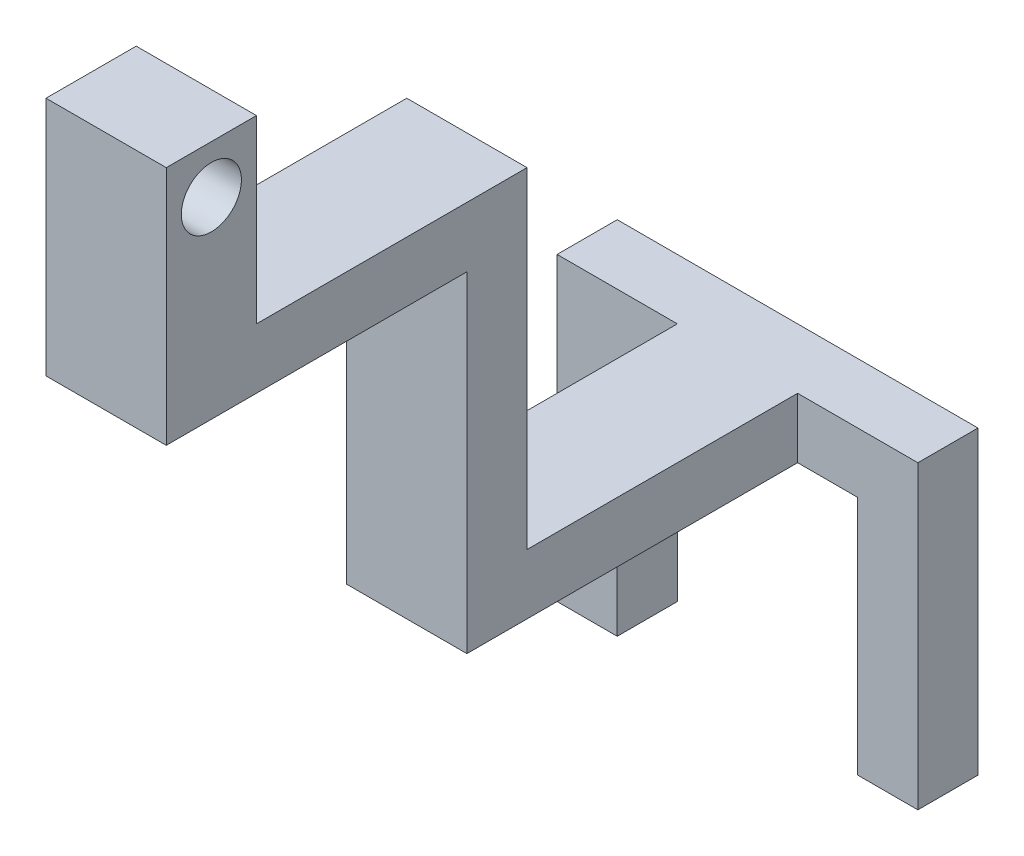
ISO-10303-21;
HEADER;
FILE_DESCRIPTION(('STEP AP214'),'2;1');
FILE_NAME('part.step','',(''),(''),'','','');
FILE_SCHEMA(('AUTOMOTIVE_DESIGN { 1 0 10303 214 1 1 1 1 }'));
ENDSEC;
DATA;
#1=APPLICATION_CONTEXT('core data for automotive mechanical design processes');
#2=APPLICATION_PROTOCOL_DEFINITION('international standard','automotive_design',2000,#1);
#3=PRODUCT_CONTEXT('',#1,'mechanical');
#4=PRODUCT('Part','Part','',(#3));
#5=PRODUCT_RELATED_PRODUCT_CATEGORY('part','',(#4));
#6=PRODUCT_DEFINITION_FORMATION('','',#4);
#7=PRODUCT_DEFINITION_CONTEXT('part definition',#1,'design');
#8=PRODUCT_DEFINITION('design','',#6,#7);
#9=PRODUCT_DEFINITION_SHAPE('','',#8);
#10=(LENGTH_UNIT() NAMED_UNIT(*) SI_UNIT(.MILLI.,.METRE.));
#11=(NAMED_UNIT(*) PLANE_ANGLE_UNIT() SI_UNIT($,.RADIAN.));
#12=(NAMED_UNIT(*) SI_UNIT($,.STERADIAN.) SOLID_ANGLE_UNIT());
#13=UNCERTAINTY_MEASURE_WITH_UNIT(LENGTH_MEASURE(1.E-05),#10,'distance_accuracy_value','');
#14=(GEOMETRIC_REPRESENTATION_CONTEXT(3) GLOBAL_UNCERTAINTY_ASSIGNED_CONTEXT((#13)) GLOBAL_UNIT_ASSIGNED_CONTEXT((#10,
#11,#12)) REPRESENTATION_CONTEXT('',''));
#15=CARTESIAN_POINT('',(0.,0.,0.));
#16=DIRECTION('',(0.,0.,1.));
#17=DIRECTION('',(1.,0.,0.));
#18=AXIS2_PLACEMENT_3D('',#15,#16,#17);
#19=CARTESIAN_POINT('',(0.,55.,0.));
#20=DIRECTION('',(0.,-1.,0.));
#21=DIRECTION('',(0.,0.,-1.));
#22=AXIS2_PLACEMENT_3D('',#19,#20,#21);
#23=PLANE('',#22);
#24=DIRECTION('',(-1.,0.,0.));
#25=VECTOR('',#24,1.);
#26=CARTESIAN_POINT('',(20.,55.,100.));
#27=LINE('',#26,#25);
#28=CARTESIAN_POINT('',(40.,55.,100.));
#29=VERTEX_POINT('',#28);
#30=CARTESIAN_POINT('',(20.,55.,100.));
#31=VERTEX_POINT('',#30);
#32=EDGE_CURVE('E56',#29,#31,#27,.T.);
#33=ORIENTED_EDGE('',*,*,#32,.F.);
#34=DIRECTION('',(0.,0.,-1.));
#35=VECTOR('',#34,1.);
#36=CARTESIAN_POINT('',(40.,55.,65.));
#37=LINE('',#36,#35);
#38=CARTESIAN_POINT('',(40.,55.,55.));
#39=VERTEX_POINT('',#38);
#40=EDGE_CURVE('E216',#29,#39,#37,.T.);
#41=ORIENTED_EDGE('',*,*,#40,.T.);
#42=DIRECTION('',(-1.,0.,0.));
#43=VECTOR('',#42,1.);
#44=CARTESIAN_POINT('',(20.,55.,55.));
#45=LINE('',#44,#43);
#46=CARTESIAN_POINT('',(20.,55.,55.));
#47=VERTEX_POINT('',#46);
#48=EDGE_CURVE('E218',#39,#47,#45,.T.);
#49=ORIENTED_EDGE('',*,*,#48,.T.);
#50=DIRECTION('',(0.,0.,1.));
#51=VECTOR('',#50,1.);
#52=CARTESIAN_POINT('',(20.,55.,65.));
#53=LINE('',#52,#51);
#54=EDGE_CURVE('E214',#47,#31,#53,.T.);
#55=ORIENTED_EDGE('',*,*,#54,.T.);
#56=EDGE_LOOP('',(#33,#41,#49,#55));
#57=FACE_BOUND('',#56,.T.);
#58=ADVANCED_FACE('F41',(#57),#23,.F.);
#59=CARTESIAN_POINT('',(0.,0.,10.));
#60=DIRECTION('',(0.,-1.,0.));
#61=DIRECTION('',(0.,0.,-1.));
#62=AXIS2_PLACEMENT_3D('',#59,#60,#61);
#63=PLANE('',#62);
#64=DIRECTION('',(-1.,0.,0.));
#65=VECTOR('',#64,1.);
#66=CARTESIAN_POINT('',(20.,0.,55.));
#67=LINE('',#66,#65);
#68=CARTESIAN_POINT('',(40.,0.,55.));
#69=VERTEX_POINT('',#68);
#70=CARTESIAN_POINT('',(20.,0.,55.));
#71=VERTEX_POINT('',#70);
#72=EDGE_CURVE('E213',#69,#71,#67,.T.);
#73=ORIENTED_EDGE('',*,*,#72,.F.);
#74=DIRECTION('',(0.,0.,-1.));
#75=VECTOR('',#74,1.);
#76=CARTESIAN_POINT('',(40.,0.,65.));
#77=LINE('',#76,#75);
#78=CARTESIAN_POINT('',(40.,0.,10.));
#79=VERTEX_POINT('',#78);
#80=EDGE_CURVE('E241',#69,#79,#77,.T.);
#81=ORIENTED_EDGE('',*,*,#80,.T.);
#82=DIRECTION('',(-1.,0.,0.));
#83=VECTOR('',#82,1.);
#84=CARTESIAN_POINT('',(0.,0.,10.));
#85=LINE('',#84,#83);
#86=CARTESIAN_POINT('',(60.,0.,10.));
#87=VERTEX_POINT('',#86);
#88=EDGE_CURVE('E268',#87,#79,#85,.T.);
#89=ORIENTED_EDGE('',*,*,#88,.F.);
#90=DIRECTION('',(0.,0.,-1.));
#91=VECTOR('',#90,1.);
#92=CARTESIAN_POINT('',(60.,0.,10.));
#93=LINE('',#92,#91);
#94=CARTESIAN_POINT('',(60.,0.,0.));
#95=VERTEX_POINT('',#94);
#96=EDGE_CURVE('E289',#87,#95,#93,.T.);
#97=ORIENTED_EDGE('',*,*,#96,.T.);
#98=DIRECTION('',(-1.,0.,0.));
#99=VECTOR('',#98,1.);
#100=CARTESIAN_POINT('',(0.,0.,0.));
#101=LINE('',#100,#99);
#102=CARTESIAN_POINT('',(0.,0.,0.));
#103=VERTEX_POINT('',#102);
#104=EDGE_CURVE('E254',#95,#103,#101,.T.);
#105=ORIENTED_EDGE('',*,*,#104,.T.);
#106=DIRECTION('',(0.,0.,-1.));
#107=VECTOR('',#106,1.);
#108=CARTESIAN_POINT('',(0.,0.,10.));
#109=LINE('',#108,#107);
#110=CARTESIAN_POINT('',(0.,0.,10.));
#111=VERTEX_POINT('',#110);
#112=EDGE_CURVE('E271',#111,#103,#109,.T.);
#113=ORIENTED_EDGE('',*,*,#112,.F.);
#114=CARTESIAN_POINT('',(20.,0.,10.));
#115=VERTEX_POINT('',#114);
#116=EDGE_CURVE('E267',#115,#111,#85,.T.);
#117=ORIENTED_EDGE('',*,*,#116,.F.);
#118=DIRECTION('',(0.,0.,-1.));
#119=VECTOR('',#118,1.);
#120=CARTESIAN_POINT('',(20.,0.,65.));
#121=LINE('',#120,#119);
#122=EDGE_CURVE('E236',#71,#115,#121,.T.);
#123=ORIENTED_EDGE('',*,*,#122,.F.);
#124=EDGE_LOOP('',(#73,#81,#89,#97,#105,#113,#117,#123));
#125=FACE_BOUND('',#124,.T.);
#126=ADVANCED_FACE('F350',(#125),#63,.F.);
#127=CARTESIAN_POINT('',(0.,0.,10.));
#128=DIRECTION('',(0.,0.,-1.));
#129=DIRECTION('',(-1.,0.,0.));
#130=AXIS2_PLACEMENT_3D('',#127,#128,#129);
#131=PLANE('',#130);
#132=DIRECTION('',(0.,-1.,0.));
#133=VECTOR('',#132,1.);
#134=CARTESIAN_POINT('',(20.,0.,10.));
#135=LINE('',#134,#133);
#136=CARTESIAN_POINT('',(20.,-10.,10.));
#137=VERTEX_POINT('',#136);
#138=EDGE_CURVE('E228',#115,#137,#135,.T.);
#139=ORIENTED_EDGE('',*,*,#138,.F.);
#140=ORIENTED_EDGE('',*,*,#116,.T.);
#141=DIRECTION('',(0.,-1.,0.));
#142=VECTOR('',#141,1.);
#143=CARTESIAN_POINT('',(0.,-50.,10.));
#144=LINE('',#143,#142);
#145=CARTESIAN_POINT('',(0.,-50.,10.));
#146=VERTEX_POINT('',#145);
#147=EDGE_CURVE('E250',#111,#146,#144,.T.);
#148=ORIENTED_EDGE('',*,*,#147,.T.);
#149=DIRECTION('',(1.,0.,0.));
#150=VECTOR('',#149,1.);
#151=CARTESIAN_POINT('',(10.,-50.,10.));
#152=LINE('',#151,#150);
#153=CARTESIAN_POINT('',(10.,-50.,10.));
#154=VERTEX_POINT('',#153);
#155=EDGE_CURVE('E253',#146,#154,#152,.T.);
#156=ORIENTED_EDGE('',*,*,#155,.T.);
#157=DIRECTION('',(0.,1.,0.));
#158=VECTOR('',#157,1.);
#159=CARTESIAN_POINT('',(10.,-10.,10.));
#160=LINE('',#159,#158);
#161=CARTESIAN_POINT('',(10.,-10.,10.));
#162=VERTEX_POINT('',#161);
#163=EDGE_CURVE('E256',#154,#162,#160,.T.);
#164=ORIENTED_EDGE('',*,*,#163,.T.);
#165=DIRECTION('',(1.,0.,0.));
#166=VECTOR('',#165,1.);
#167=CARTESIAN_POINT('',(50.,-10.,10.));
#168=LINE('',#167,#166);
#169=EDGE_CURVE('E259',#162,#137,#168,.T.);
#170=ORIENTED_EDGE('',*,*,#169,.T.);
#171=EDGE_LOOP('',(#139,#140,#148,#156,#164,#170));
#172=FACE_BOUND('',#171,.T.);
#173=ADVANCED_FACE('F357',(#172),#131,.F.);
#174=DIRECTION('',(0.,1.,0.));
#175=VECTOR('',#174,1.);
#176=CARTESIAN_POINT('',(40.,0.,10.));
#177=LINE('',#176,#175);
#178=CARTESIAN_POINT('',(40.,-10.,10.));
#179=VERTEX_POINT('',#178);
#180=EDGE_CURVE('E232',#179,#79,#177,.T.);
#181=ORIENTED_EDGE('',*,*,#180,.F.);
#182=CARTESIAN_POINT('',(50.,-10.,10.));
#183=VERTEX_POINT('',#182);
#184=EDGE_CURVE('E258',#179,#183,#168,.T.);
#185=ORIENTED_EDGE('',*,*,#184,.T.);
#186=DIRECTION('',(0.,-1.,0.));
#187=VECTOR('',#186,1.);
#188=CARTESIAN_POINT('',(50.,-50.,10.));
#189=LINE('',#188,#187);
#190=CARTESIAN_POINT('',(50.,-50.,10.));
#191=VERTEX_POINT('',#190);
#192=EDGE_CURVE('E261',#183,#191,#189,.T.);
#193=ORIENTED_EDGE('',*,*,#192,.T.);
#194=DIRECTION('',(1.,0.,0.));
#195=VECTOR('',#194,1.);
#196=CARTESIAN_POINT('',(60.,-50.,10.));
#197=LINE('',#196,#195);
#198=CARTESIAN_POINT('',(60.,-50.,10.));
#199=VERTEX_POINT('',#198);
#200=EDGE_CURVE('E263',#191,#199,#197,.T.);
#201=ORIENTED_EDGE('',*,*,#200,.T.);
#202=DIRECTION('',(0.,1.,0.));
#203=VECTOR('',#202,1.);
#204=CARTESIAN_POINT('',(60.,0.,10.));
#205=LINE('',#204,#203);
#206=EDGE_CURVE('E265',#199,#87,#205,.T.);
#207=ORIENTED_EDGE('',*,*,#206,.T.);
#208=ORIENTED_EDGE('',*,*,#88,.T.);
#209=EDGE_LOOP('',(#181,#185,#193,#201,#207,#208));
#210=FACE_BOUND('',#209,.T.);
#211=ADVANCED_FACE('F328',(#210),#131,.F.);
#212=CARTESIAN_POINT('',(0.,-50.,10.));
#213=DIRECTION('',(1.,0.,0.));
#214=DIRECTION('',(0.,0.,-1.));
#215=AXIS2_PLACEMENT_3D('',#212,#213,#214);
#216=PLANE('',#215);
#217=DIRECTION('',(0.,-1.,0.));
#218=VECTOR('',#217,1.);
#219=CARTESIAN_POINT('',(0.,-50.,0.));
#220=LINE('',#219,#218);
#221=CARTESIAN_POINT('',(0.,-50.,0.));
#222=VERTEX_POINT('',#221);
#223=EDGE_CURVE('E249',#103,#222,#220,.T.);
#224=ORIENTED_EDGE('',*,*,#223,.T.);
#225=DIRECTION('',(0.,0.,-1.));
#226=VECTOR('',#225,1.);
#227=CARTESIAN_POINT('',(0.,-50.,10.));
#228=LINE('',#227,#226);
#229=EDGE_CURVE('E11',#146,#222,#228,.T.);
#230=ORIENTED_EDGE('',*,*,#229,.F.);
#231=ORIENTED_EDGE('',*,*,#147,.F.);
#232=ORIENTED_EDGE('',*,*,#112,.T.);
#233=EDGE_LOOP('',(#224,#230,#231,#232));
#234=FACE_BOUND('',#233,.T.);
#235=ADVANCED_FACE('F43',(#234),#216,.F.);
#236=CARTESIAN_POINT('',(10.,-50.,10.));
#237=DIRECTION('',(0.,1.,0.));
#238=DIRECTION('',(0.,0.,1.));
#239=AXIS2_PLACEMENT_3D('',#236,#237,#238);
#240=PLANE('',#239);
#241=DIRECTION('',(1.,0.,0.));
#242=VECTOR('',#241,1.);
#243=CARTESIAN_POINT('',(10.,-50.,0.));
#244=LINE('',#243,#242);
#245=CARTESIAN_POINT('',(10.,-50.,0.));
#246=VERTEX_POINT('',#245);
#247=EDGE_CURVE('E274',#222,#246,#244,.T.);
#248=ORIENTED_EDGE('',*,*,#247,.T.);
#249=DIRECTION('',(0.,0.,-1.));
#250=VECTOR('',#249,1.);
#251=CARTESIAN_POINT('',(10.,-50.,10.));
#252=LINE('',#251,#250);
#253=EDGE_CURVE('E49',#154,#246,#252,.T.);
#254=ORIENTED_EDGE('',*,*,#253,.F.);
#255=ORIENTED_EDGE('',*,*,#155,.F.);
#256=ORIENTED_EDGE('',*,*,#229,.T.);
#257=EDGE_LOOP('',(#248,#254,#255,#256));
#258=FACE_BOUND('',#257,.T.);
#259=ADVANCED_FACE('F360',(#258),#240,.F.);
#260=CARTESIAN_POINT('',(10.,-10.,10.));
#261=DIRECTION('',(-1.,0.,0.));
#262=DIRECTION('',(0.,-1.,0.));
#263=AXIS2_PLACEMENT_3D('',#260,#261,#262);
#264=PLANE('',#263);
#265=DIRECTION('',(0.,1.,0.));
#266=VECTOR('',#265,1.);
#267=CARTESIAN_POINT('',(10.,-10.,0.));
#268=LINE('',#267,#266);
#269=CARTESIAN_POINT('',(10.,-10.,0.));
#270=VERTEX_POINT('',#269);
#271=EDGE_CURVE('E276',#246,#270,#268,.T.);
#272=ORIENTED_EDGE('',*,*,#271,.T.);
#273=DIRECTION('',(0.,0.,-1.));
#274=VECTOR('',#273,1.);
#275=CARTESIAN_POINT('',(10.,-10.,10.));
#276=LINE('',#275,#274);
#277=EDGE_CURVE('E301',#162,#270,#276,.T.);
#278=ORIENTED_EDGE('',*,*,#277,.F.);
#279=ORIENTED_EDGE('',*,*,#163,.F.);
#280=ORIENTED_EDGE('',*,*,#253,.T.);
#281=EDGE_LOOP('',(#272,#278,#279,#280));
#282=FACE_BOUND('',#281,.T.);
#283=ADVANCED_FACE('F308',(#282),#264,.F.);
#284=CARTESIAN_POINT('',(50.,-10.,10.));
#285=DIRECTION('',(0.,1.,0.));
#286=DIRECTION('',(-1.,0.,0.));
#287=AXIS2_PLACEMENT_3D('',#284,#285,#286);
#288=PLANE('',#287);
#289=DIRECTION('',(1.,0.,0.));
#290=VECTOR('',#289,1.);
#291=CARTESIAN_POINT('',(50.,-10.,0.));
#292=LINE('',#291,#290);
#293=CARTESIAN_POINT('',(50.,-10.,0.));
#294=VERTEX_POINT('',#293);
#295=EDGE_CURVE('E278',#270,#294,#292,.T.);
#296=ORIENTED_EDGE('',*,*,#295,.T.);
#297=DIRECTION('',(0.,0.,-1.));
#298=VECTOR('',#297,1.);
#299=CARTESIAN_POINT('',(50.,-10.,10.));
#300=LINE('',#299,#298);
#301=EDGE_CURVE('E298',#183,#294,#300,.T.);
#302=ORIENTED_EDGE('',*,*,#301,.F.);
#303=ORIENTED_EDGE('',*,*,#184,.F.);
#304=DIRECTION('',(0.,0.,-1.));
#305=VECTOR('',#304,1.);
#306=CARTESIAN_POINT('',(40.,-10.,65.));
#307=LINE('',#306,#305);
#308=CARTESIAN_POINT('',(40.,-10.,65.));
#309=VERTEX_POINT('',#308);
#310=EDGE_CURVE('E243',#309,#179,#307,.T.);
#311=ORIENTED_EDGE('',*,*,#310,.F.);
#312=DIRECTION('',(1.,0.,0.));
#313=VECTOR('',#312,1.);
#314=CARTESIAN_POINT('',(20.,-10.,65.));
#315=LINE('',#314,#313);
#316=CARTESIAN_POINT('',(20.,-10.,65.));
#317=VERTEX_POINT('',#316);
#318=EDGE_CURVE('E231',#317,#309,#315,.T.);
#319=ORIENTED_EDGE('',*,*,#318,.F.);
#320=DIRECTION('',(0.,0.,-1.));
#321=VECTOR('',#320,1.);
#322=CARTESIAN_POINT('',(20.,-10.,65.));
#323=LINE('',#322,#321);
#324=EDGE_CURVE('E246',#317,#137,#323,.T.);
#325=ORIENTED_EDGE('',*,*,#324,.T.);
#326=ORIENTED_EDGE('',*,*,#169,.F.);
#327=ORIENTED_EDGE('',*,*,#277,.T.);
#328=EDGE_LOOP('',(#296,#302,#303,#311,#319,#325,#326,#327));
#329=FACE_BOUND('',#328,.T.);
#330=ADVANCED_FACE('F319',(#329),#288,.F.);
#331=CARTESIAN_POINT('',(50.,-50.,10.));
#332=DIRECTION('',(1.,0.,0.));
#333=DIRECTION('',(0.,0.,-1.));
#334=AXIS2_PLACEMENT_3D('',#331,#332,#333);
#335=PLANE('',#334);
#336=DIRECTION('',(0.,-1.,0.));
#337=VECTOR('',#336,1.);
#338=CARTESIAN_POINT('',(50.,-50.,0.));
#339=LINE('',#338,#337);
#340=CARTESIAN_POINT('',(50.,-50.,0.));
#341=VERTEX_POINT('',#340);
#342=EDGE_CURVE('E280',#294,#341,#339,.T.);
#343=ORIENTED_EDGE('',*,*,#342,.T.);
#344=DIRECTION('',(0.,0.,-1.));
#345=VECTOR('',#344,1.);
#346=CARTESIAN_POINT('',(50.,-50.,10.));
#347=LINE('',#346,#345);
#348=EDGE_CURVE('E295',#191,#341,#347,.T.);
#349=ORIENTED_EDGE('',*,*,#348,.F.);
#350=ORIENTED_EDGE('',*,*,#192,.F.);
#351=ORIENTED_EDGE('',*,*,#301,.T.);
#352=EDGE_LOOP('',(#343,#349,#350,#351));
#353=FACE_BOUND('',#352,.T.);
#354=ADVANCED_FACE('F324',(#353),#335,.F.);
#355=CARTESIAN_POINT('',(60.,-50.,10.));
#356=DIRECTION('',(0.,1.,0.));
#357=DIRECTION('',(0.,0.,1.));
#358=AXIS2_PLACEMENT_3D('',#355,#356,#357);
#359=PLANE('',#358);
#360=DIRECTION('',(1.,0.,0.));
#361=VECTOR('',#360,1.);
#362=CARTESIAN_POINT('',(60.,-50.,0.));
#363=LINE('',#362,#361);
#364=CARTESIAN_POINT('',(60.,-50.,0.));
#365=VERTEX_POINT('',#364);
#366=EDGE_CURVE('E282',#341,#365,#363,.T.);
#367=ORIENTED_EDGE('',*,*,#366,.T.);
#368=DIRECTION('',(0.,0.,-1.));
#369=VECTOR('',#368,1.);
#370=CARTESIAN_POINT('',(60.,-50.,10.));
#371=LINE('',#370,#369);
#372=EDGE_CURVE('E292',#199,#365,#371,.T.);
#373=ORIENTED_EDGE('',*,*,#372,.F.);
#374=ORIENTED_EDGE('',*,*,#200,.F.);
#375=ORIENTED_EDGE('',*,*,#348,.T.);
#376=EDGE_LOOP('',(#367,#373,#374,#375));
#377=FACE_BOUND('',#376,.T.);
#378=ADVANCED_FACE('F369',(#377),#359,.F.);
#379=CARTESIAN_POINT('',(60.,0.,10.));
#380=DIRECTION('',(-1.,0.,0.));
#381=DIRECTION('',(0.,-1.,0.));
#382=AXIS2_PLACEMENT_3D('',#379,#380,#381);
#383=PLANE('',#382);
#384=DIRECTION('',(0.,1.,0.));
#385=VECTOR('',#384,1.);
#386=CARTESIAN_POINT('',(60.,0.,0.));
#387=LINE('',#386,#385);
#388=EDGE_CURVE('E284',#365,#95,#387,.T.);
#389=ORIENTED_EDGE('',*,*,#388,.T.);
#390=ORIENTED_EDGE('',*,*,#96,.F.);
#391=ORIENTED_EDGE('',*,*,#206,.F.);
#392=ORIENTED_EDGE('',*,*,#372,.T.);
#393=EDGE_LOOP('',(#389,#390,#391,#392));
#394=FACE_BOUND('',#393,.T.);
#395=ADVANCED_FACE('F367',(#394),#383,.F.);
#396=CARTESIAN_POINT('',(0.,0.,0.));
#397=DIRECTION('',(0.,0.,-1.));
#398=DIRECTION('',(-1.,0.,0.));
#399=AXIS2_PLACEMENT_3D('',#396,#397,#398);
#400=PLANE('',#399);
#401=ORIENTED_EDGE('',*,*,#223,.F.);
#402=ORIENTED_EDGE('',*,*,#104,.F.);
#403=ORIENTED_EDGE('',*,*,#388,.F.);
#404=ORIENTED_EDGE('',*,*,#366,.F.);
#405=ORIENTED_EDGE('',*,*,#342,.F.);
#406=ORIENTED_EDGE('',*,*,#295,.F.);
#407=ORIENTED_EDGE('',*,*,#271,.F.);
#408=ORIENTED_EDGE('',*,*,#247,.F.);
#409=EDGE_LOOP('',(#401,#402,#403,#404,#405,#406,#407,#408));
#410=FACE_BOUND('',#409,.T.);
#411=ADVANCED_FACE('F314',(#410),#400,.T.);
#412=CARTESIAN_POINT('',(20.,0.,65.));
#413=DIRECTION('',(1.,0.,0.));
#414=DIRECTION('',(0.,1.,0.));
#415=AXIS2_PLACEMENT_3D('',#412,#413,#414);
#416=PLANE('',#415);
#417=CARTESIAN_POINT('',(20.,77.,107.5));
#418=DIRECTION('',(1.,0.,0.));
#419=DIRECTION('',(0.,0.,-1.));
#420=AXIS2_PLACEMENT_3D('',#417,#418,#419);
#421=CIRCLE('',#420,4.99999999999999);
#422=CARTESIAN_POINT('',(20.,77.,102.5));
#423=VERTEX_POINT('',#422);
#424=EDGE_CURVE('E193',#423,#423,#421,.T.);
#425=ORIENTED_EDGE('',*,*,#424,.T.);
#426=EDGE_LOOP('',(#425));
#427=FACE_BOUND('',#426,.T.);
#428=ORIENTED_EDGE('',*,*,#138,.T.);
#429=ORIENTED_EDGE('',*,*,#324,.F.);
#430=DIRECTION('',(0.,-1.,0.));
#431=VECTOR('',#430,1.);
#432=CARTESIAN_POINT('',(20.,0.,65.));
#433=LINE('',#432,#431);
#434=CARTESIAN_POINT('',(20.,45.,65.));
#435=VERTEX_POINT('',#434);
#436=EDGE_CURVE('E229',#435,#317,#433,.T.);
#437=ORIENTED_EDGE('',*,*,#436,.F.);
#438=DIRECTION('',(0.,0.,-1.));
#439=VECTOR('',#438,1.);
#440=CARTESIAN_POINT('',(20.,45.,115.));
#441=LINE('',#440,#439);
#442=CARTESIAN_POINT('',(20.,45.,115.));
#443=VERTEX_POINT('',#442);
#444=EDGE_CURVE('E175',#443,#435,#441,.T.);
#445=ORIENTED_EDGE('',*,*,#444,.F.);
#446=DIRECTION('',(0.,-1.,0.));
#447=VECTOR('',#446,1.);
#448=CARTESIAN_POINT('',(20.,55.,115.));
#449=LINE('',#448,#447);
#450=CARTESIAN_POINT('',(20.,85.,115.));
#451=VERTEX_POINT('',#450);
#452=EDGE_CURVE('E167',#451,#443,#449,.T.);
#453=ORIENTED_EDGE('',*,*,#452,.F.);
#454=DIRECTION('',(0.,0.,1.));
#455=VECTOR('',#454,1.);
#456=CARTESIAN_POINT('',(20.,85.,115.));
#457=LINE('',#456,#455);
#458=CARTESIAN_POINT('',(20.,85.,100.));
#459=VERTEX_POINT('',#458);
#460=EDGE_CURVE('E173',#459,#451,#457,.T.);
#461=ORIENTED_EDGE('',*,*,#460,.F.);
#462=DIRECTION('',(0.,-1.,0.));
#463=VECTOR('',#462,1.);
#464=CARTESIAN_POINT('',(20.,85.,100.));
#465=LINE('',#464,#463);
#466=EDGE_CURVE('E200',#459,#31,#465,.T.);
#467=ORIENTED_EDGE('',*,*,#466,.T.);
#468=ORIENTED_EDGE('',*,*,#54,.F.);
#469=DIRECTION('',(0.,-1.,0.));
#470=VECTOR('',#469,1.);
#471=CARTESIAN_POINT('',(20.,55.,55.));
#472=LINE('',#471,#470);
#473=EDGE_CURVE('E220',#47,#71,#472,.T.);
#474=ORIENTED_EDGE('',*,*,#473,.T.);
#475=ORIENTED_EDGE('',*,*,#122,.T.);
#476=EDGE_LOOP('',(#428,#429,#437,#445,#453,#461,#467,#468,#474,#475));
#477=FACE_BOUND('',#476,.T.);
#478=ADVANCED_FACE('F170',(#427,#477),#416,.F.);
#479=CARTESIAN_POINT('',(40.,0.,65.));
#480=DIRECTION('',(-1.,0.,0.));
#481=DIRECTION('',(0.,0.,1.));
#482=AXIS2_PLACEMENT_3D('',#479,#480,#481);
#483=PLANE('',#482);
#484=CARTESIAN_POINT('',(40.,77.,107.5));
#485=DIRECTION('',(1.,0.,0.));
#486=DIRECTION('',(0.,0.,-1.));
#487=AXIS2_PLACEMENT_3D('',#484,#485,#486);
#488=CIRCLE('',#487,4.99999999999999);
#489=CARTESIAN_POINT('',(40.,77.,102.5));
#490=VERTEX_POINT('',#489);
#491=EDGE_CURVE('E196',#490,#490,#488,.T.);
#492=ORIENTED_EDGE('',*,*,#491,.F.);
#493=EDGE_LOOP('',(#492));
#494=FACE_BOUND('',#493,.T.);
#495=ORIENTED_EDGE('',*,*,#180,.T.);
#496=ORIENTED_EDGE('',*,*,#80,.F.);
#497=DIRECTION('',(0.,-1.,0.));
#498=VECTOR('',#497,1.);
#499=CARTESIAN_POINT('',(40.,55.,55.));
#500=LINE('',#499,#498);
#501=EDGE_CURVE('E225',#39,#69,#500,.T.);
#502=ORIENTED_EDGE('',*,*,#501,.F.);
#503=ORIENTED_EDGE('',*,*,#40,.F.);
#504=DIRECTION('',(0.,-1.,0.));
#505=VECTOR('',#504,1.);
#506=CARTESIAN_POINT('',(40.,85.,100.));
#507=LINE('',#506,#505);
#508=CARTESIAN_POINT('',(40.,85.,100.));
#509=VERTEX_POINT('',#508);
#510=EDGE_CURVE('E203',#509,#29,#507,.T.);
#511=ORIENTED_EDGE('',*,*,#510,.F.);
#512=DIRECTION('',(0.,0.,-1.));
#513=VECTOR('',#512,1.);
#514=CARTESIAN_POINT('',(40.,85.,115.));
#515=LINE('',#514,#513);
#516=CARTESIAN_POINT('',(40.,85.,115.));
#517=VERTEX_POINT('',#516);
#518=EDGE_CURVE('E186',#517,#509,#515,.T.);
#519=ORIENTED_EDGE('',*,*,#518,.F.);
#520=DIRECTION('',(0.,1.,0.));
#521=VECTOR('',#520,1.);
#522=CARTESIAN_POINT('',(40.,55.,115.));
#523=LINE('',#522,#521);
#524=CARTESIAN_POINT('',(40.,45.,115.));
#525=VERTEX_POINT('',#524);
#526=EDGE_CURVE('E183',#525,#517,#523,.T.);
#527=ORIENTED_EDGE('',*,*,#526,.F.);
#528=DIRECTION('',(0.,0.,-1.));
#529=VECTOR('',#528,1.);
#530=CARTESIAN_POINT('',(40.,45.,115.));
#531=LINE('',#530,#529);
#532=CARTESIAN_POINT('',(40.,45.,65.));
#533=VERTEX_POINT('',#532);
#534=EDGE_CURVE('E208',#525,#533,#531,.T.);
#535=ORIENTED_EDGE('',*,*,#534,.T.);
#536=DIRECTION('',(0.,1.,0.));
#537=VECTOR('',#536,1.);
#538=CARTESIAN_POINT('',(40.,0.,65.));
#539=LINE('',#538,#537);
#540=EDGE_CURVE('E234',#309,#533,#539,.T.);
#541=ORIENTED_EDGE('',*,*,#540,.F.);
#542=ORIENTED_EDGE('',*,*,#310,.T.);
#543=EDGE_LOOP('',(#495,#496,#502,#503,#511,#519,#527,#535,#541,#542));
#544=FACE_BOUND('',#543,.T.);
#545=ADVANCED_FACE('F334',(#494,#544),#483,.F.);
#546=CARTESIAN_POINT('',(0.,0.,65.));
#547=DIRECTION('',(0.,0.,1.));
#548=DIRECTION('',(1.,0.,0.));
#549=AXIS2_PLACEMENT_3D('',#546,#547,#548);
#550=PLANE('',#549);
#551=DIRECTION('',(1.,0.,0.));
#552=VECTOR('',#551,1.);
#553=CARTESIAN_POINT('',(20.,45.,65.));
#554=LINE('',#553,#552);
#555=EDGE_CURVE('E64',#435,#533,#554,.T.);
#556=ORIENTED_EDGE('',*,*,#555,.F.);
#557=ORIENTED_EDGE('',*,*,#436,.T.);
#558=ORIENTED_EDGE('',*,*,#318,.T.);
#559=ORIENTED_EDGE('',*,*,#540,.T.);
#560=EDGE_LOOP('',(#556,#557,#558,#559));
#561=FACE_BOUND('',#560,.T.);
#562=ADVANCED_FACE('F337',(#561),#550,.T.);
#563=CARTESIAN_POINT('',(20.,55.,55.));
#564=DIRECTION('',(0.,0.,1.));
#565=DIRECTION('',(1.,0.,0.));
#566=AXIS2_PLACEMENT_3D('',#563,#564,#565);
#567=PLANE('',#566);
#568=ORIENTED_EDGE('',*,*,#72,.T.);
#569=ORIENTED_EDGE('',*,*,#473,.F.);
#570=ORIENTED_EDGE('',*,*,#48,.F.);
#571=ORIENTED_EDGE('',*,*,#501,.T.);
#572=EDGE_LOOP('',(#568,#569,#570,#571));
#573=FACE_BOUND('',#572,.T.);
#574=ADVANCED_FACE('F348',(#573),#567,.F.);
#575=CARTESIAN_POINT('',(20.,45.,115.));
#576=DIRECTION('',(0.,1.,0.));
#577=DIRECTION('',(0.,0.,1.));
#578=AXIS2_PLACEMENT_3D('',#575,#576,#577);
#579=PLANE('',#578);
#580=ORIENTED_EDGE('',*,*,#555,.T.);
#581=ORIENTED_EDGE('',*,*,#534,.F.);
#582=DIRECTION('',(1.,0.,0.));
#583=VECTOR('',#582,1.);
#584=CARTESIAN_POINT('',(20.,45.,115.));
#585=LINE('',#584,#583);
#586=EDGE_CURVE('E177',#443,#525,#585,.T.);
#587=ORIENTED_EDGE('',*,*,#586,.F.);
#588=ORIENTED_EDGE('',*,*,#444,.T.);
#589=EDGE_LOOP('',(#580,#581,#587,#588));
#590=FACE_BOUND('',#589,.T.);
#591=ADVANCED_FACE('F339',(#590),#579,.F.);
#592=CARTESIAN_POINT('',(0.,0.,115.));
#593=DIRECTION('',(0.,0.,1.));
#594=DIRECTION('',(1.,0.,0.));
#595=AXIS2_PLACEMENT_3D('',#592,#593,#594);
#596=PLANE('',#595);
#597=ORIENTED_EDGE('',*,*,#452,.T.);
#598=ORIENTED_EDGE('',*,*,#586,.T.);
#599=ORIENTED_EDGE('',*,*,#526,.T.);
#600=DIRECTION('',(1.,0.,0.));
#601=VECTOR('',#600,1.);
#602=CARTESIAN_POINT('',(20.,85.,115.));
#603=LINE('',#602,#601);
#604=EDGE_CURVE('E180',#451,#517,#603,.T.);
#605=ORIENTED_EDGE('',*,*,#604,.F.);
#606=EDGE_LOOP('',(#597,#598,#599,#605));
#607=FACE_BOUND('',#606,.T.);
#608=ADVANCED_FACE('F181',(#607),#596,.T.);
#609=CARTESIAN_POINT('',(20.,85.,100.));
#610=DIRECTION('',(0.,0.,1.));
#611=DIRECTION('',(1.,0.,0.));
#612=AXIS2_PLACEMENT_3D('',#609,#610,#611);
#613=PLANE('',#612);
#614=ORIENTED_EDGE('',*,*,#32,.T.);
#615=ORIENTED_EDGE('',*,*,#466,.F.);
#616=DIRECTION('',(-1.,0.,0.));
#617=VECTOR('',#616,1.);
#618=CARTESIAN_POINT('',(20.,85.,100.));
#619=LINE('',#618,#617);
#620=EDGE_CURVE('E190',#509,#459,#619,.T.);
#621=ORIENTED_EDGE('',*,*,#620,.F.);
#622=ORIENTED_EDGE('',*,*,#510,.T.);
#623=EDGE_LOOP('',(#614,#615,#621,#622));
#624=FACE_BOUND('',#623,.T.);
#625=ADVANCED_FACE('F343',(#624),#613,.F.);
#626=CARTESIAN_POINT('',(0.,85.,0.));
#627=DIRECTION('',(0.,-1.,0.));
#628=DIRECTION('',(0.,0.,-1.));
#629=AXIS2_PLACEMENT_3D('',#626,#627,#628);
#630=PLANE('',#629);
#631=ORIENTED_EDGE('',*,*,#460,.T.);
#632=ORIENTED_EDGE('',*,*,#604,.T.);
#633=ORIENTED_EDGE('',*,*,#518,.T.);
#634=ORIENTED_EDGE('',*,*,#620,.T.);
#635=EDGE_LOOP('',(#631,#632,#633,#634));
#636=FACE_BOUND('',#635,.T.);
#637=ADVANCED_FACE('F188',(#636),#630,.F.);
#638=CARTESIAN_POINT('',(20.,77.,107.5));
#639=DIRECTION('',(1.,0.,0.));
#640=DIRECTION('',(0.,0.,-1.));
#641=AXIS2_PLACEMENT_3D('',#638,#639,#640);
#642=CYLINDRICAL_SURFACE('',#641,4.99999999999999);
#643=ORIENTED_EDGE('',*,*,#424,.F.);
#644=EDGE_LOOP('',(#643));
#645=FACE_BOUND('',#644,.T.);
#646=ORIENTED_EDGE('',*,*,#491,.T.);
#647=EDGE_LOOP('',(#646));
#648=FACE_BOUND('',#647,.T.);
#649=ADVANCED_FACE('F483',(#645,#648),#642,.F.);
#650=CLOSED_SHELL('',(#58,#126,#173,#211,#235,#259,#283,#330,#354,#378,#395,#411,#478,#545,#562,
#574,#591,#608,#625,#637,#649));
#651=MANIFOLD_SOLID_BREP('B2',#650);
#652=ADVANCED_BREP_SHAPE_REPRESENTATION('',(#18,#651),#14);
#653=SHAPE_DEFINITION_REPRESENTATION(#9,#652);
ENDSEC;
END-ISO-10303-21;
